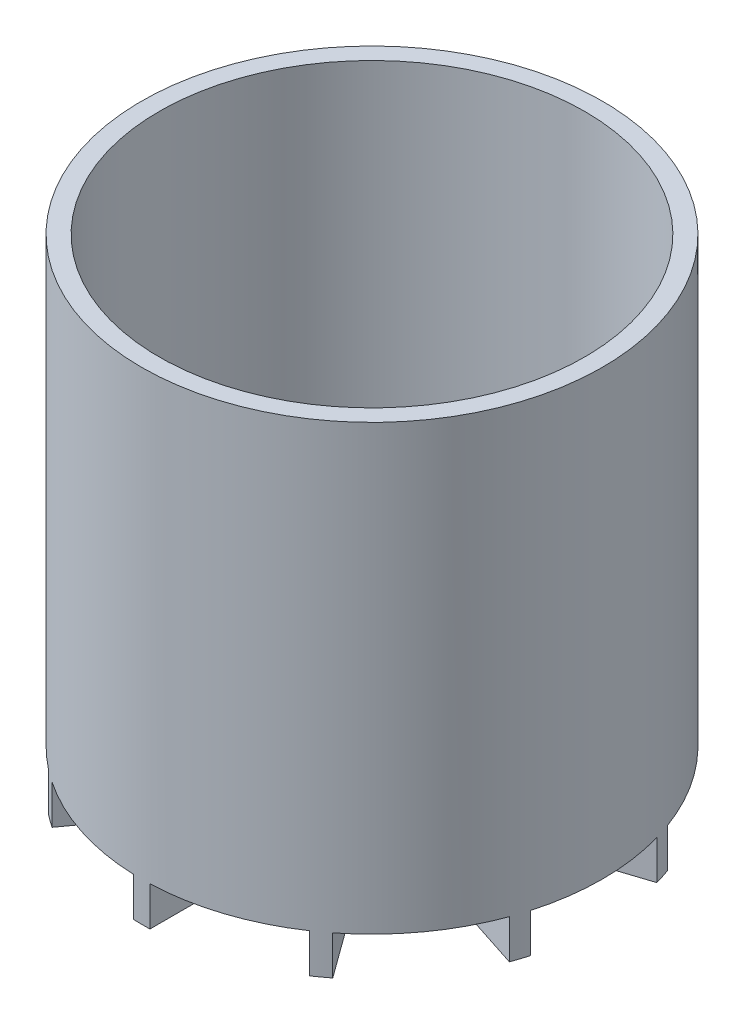
ISO-10303-21;
HEADER;
FILE_DESCRIPTION(('STEP AP214'),'2;1');
FILE_NAME('part.step','',(''),(''),'','','');
FILE_SCHEMA(('AUTOMOTIVE_DESIGN { 1 0 10303 214 1 1 1 1 }'));
ENDSEC;
DATA;
#1=APPLICATION_CONTEXT('core data for automotive mechanical design processes');
#2=APPLICATION_PROTOCOL_DEFINITION('international standard','automotive_design',2000,#1);
#3=PRODUCT_CONTEXT('',#1,'mechanical');
#4=PRODUCT('Part','Part','',(#3));
#5=PRODUCT_RELATED_PRODUCT_CATEGORY('part','',(#4));
#6=PRODUCT_DEFINITION_FORMATION('','',#4);
#7=PRODUCT_DEFINITION_CONTEXT('part definition',#1,'design');
#8=PRODUCT_DEFINITION('design','',#6,#7);
#9=PRODUCT_DEFINITION_SHAPE('','',#8);
#10=(LENGTH_UNIT() NAMED_UNIT(*) SI_UNIT(.MILLI.,.METRE.));
#11=(NAMED_UNIT(*) PLANE_ANGLE_UNIT() SI_UNIT($,.RADIAN.));
#12=(NAMED_UNIT(*) SI_UNIT($,.STERADIAN.) SOLID_ANGLE_UNIT());
#13=UNCERTAINTY_MEASURE_WITH_UNIT(LENGTH_MEASURE(1.E-05),#10,'distance_accuracy_value','');
#14=(GEOMETRIC_REPRESENTATION_CONTEXT(3) GLOBAL_UNCERTAINTY_ASSIGNED_CONTEXT((#13)) GLOBAL_UNIT_ASSIGNED_CONTEXT((#10,
#11,#12)) REPRESENTATION_CONTEXT('',''));
#15=CARTESIAN_POINT('',(0.,0.,0.));
#16=DIRECTION('',(0.,0.,1.));
#17=DIRECTION('',(1.,0.,0.));
#18=AXIS2_PLACEMENT_3D('',#15,#16,#17);
#19=CARTESIAN_POINT('',(0.,3.71094018845128,0.));
#20=DIRECTION('',(0.,-1.,0.));
#21=DIRECTION('',(0.,0.,-1.));
#22=AXIS2_PLACEMENT_3D('',#19,#20,#21);
#23=PLANE('',#22);
#24=DIRECTION('',(-0.587785252292469,0.,0.809016994374951));
#25=VECTOR('',#24,1.);
#26=CARTESIAN_POINT('',(14.1829604903441,3.71094018845128,-21.0916026592399));
#27=LINE('',#26,#25);
#28=CARTESIAN_POINT('',(14.1730982807933,3.71094018845128,-21.0780284923181));
#29=VERTEX_POINT('',#28);
#30=CARTESIAN_POINT('',(0.923076923076934,3.71094018845128,-2.84093864970028));
#31=VERTEX_POINT('',#30);
#32=EDGE_CURVE('E557',#29,#31,#27,.T.);
#33=ORIENTED_EDGE('',*,*,#32,.F.);
#34=CARTESIAN_POINT('',(0.,3.71094018845128,0.));
#35=DIRECTION('',(0.,-1.,0.));
#36=DIRECTION('',(0.,0.,-1.));
#37=AXIS2_PLACEMENT_3D('',#34,#35,#36);
#38=CIRCLE('',#37,25.4);
#39=CARTESIAN_POINT('',(15.6666681165624,3.71094018845128,-19.9928864880859));
#40=VERTEX_POINT('',#39);
#41=EDGE_CURVE('E481',#29,#40,#38,.T.);
#42=ORIENTED_EDGE('',*,*,#41,.T.);
#43=DIRECTION('',(-0.587785252292469,0.,0.809016994374951));
#44=VECTOR('',#43,1.);
#45=CARTESIAN_POINT('',(15.6765303261133,3.71094018845128,-20.0064606550076));
#46=LINE('',#45,#44);
#47=CARTESIAN_POINT('',(2.41664675884607,3.71094018845128,-1.755796645468));
#48=VERTEX_POINT('',#47);
#49=EDGE_CURVE('E552',#40,#48,#46,.T.);
#50=ORIENTED_EDGE('',*,*,#49,.T.);
#51=DIRECTION('',(-0.951056516295152,0.,0.309016994374952));
#52=VECTOR('',#51,1.);
#53=CARTESIAN_POINT('',(23.8715890575508,3.71094018845128,-8.72692997985776));
#54=LINE('',#53,#52);
#55=CARTESIAN_POINT('',(23.8556316672933,3.71094018845128,-8.72174510946262));
#56=VERTEX_POINT('',#55);
#57=EDGE_CURVE('E542',#56,#48,#54,.T.);
#58=ORIENTED_EDGE('',*,*,#57,.F.);
#59=CARTESIAN_POINT('',(24.4261245799855,3.71094018845128,-6.96594846399464));
#60=VERTEX_POINT('',#59);
#61=EDGE_CURVE('E687',#56,#60,#38,.T.);
#62=ORIENTED_EDGE('',*,*,#61,.T.);
#63=DIRECTION('',(-0.951056516295152,0.,0.309016994374952));
#64=VECTOR('',#63,1.);
#65=CARTESIAN_POINT('',(24.442081970243,3.71094018845128,-6.97113333438978));
#66=LINE('',#65,#64);
#67=CARTESIAN_POINT('',(2.98713967153826,3.71094018845128,0.));
#68=VERTEX_POINT('',#67);
#69=EDGE_CURVE('E537',#60,#68,#66,.T.);
#70=ORIENTED_EDGE('',*,*,#69,.T.);
#71=DIRECTION('',(-0.951056516295154,0.,-0.309016994374945));
#72=VECTOR('',#71,1.);
#73=CARTESIAN_POINT('',(24.442081970243,3.71094018845128,6.97113333438961));
#74=LINE('',#73,#72);
#75=CARTESIAN_POINT('',(24.4261245799855,3.71094018845128,6.96594846399447));
#76=VERTEX_POINT('',#75);
#77=EDGE_CURVE('E527',#76,#68,#74,.T.);
#78=ORIENTED_EDGE('',*,*,#77,.F.);
#79=CARTESIAN_POINT('',(23.8556316672933,3.71094018845128,8.72174510946245));
#80=VERTEX_POINT('',#79);
#81=EDGE_CURVE('E688',#76,#80,#38,.T.);
#82=ORIENTED_EDGE('',*,*,#81,.T.);
#83=DIRECTION('',(-0.951056516295154,0.,-0.309016994374945));
#84=VECTOR('',#83,1.);
#85=CARTESIAN_POINT('',(23.8715890575508,3.71094018845128,8.72692997985759));
#86=LINE('',#85,#84);
#87=CARTESIAN_POINT('',(2.41664675884606,3.71094018845128,1.75579664546797));
#88=VERTEX_POINT('',#87);
#89=EDGE_CURVE('E523',#80,#88,#86,.T.);
#90=ORIENTED_EDGE('',*,*,#89,.T.);
#91=DIRECTION('',(-0.587785252292474,0.,-0.809016994374947));
#92=VECTOR('',#91,1.);
#93=CARTESIAN_POINT('',(15.6765303261134,3.71094018845128,20.0064606550075));
#94=LINE('',#93,#92);
#95=CARTESIAN_POINT('',(15.6666681165625,3.71094018845128,19.9928864880858));
#96=VERTEX_POINT('',#95);
#97=EDGE_CURVE('E512',#96,#88,#94,.T.);
#98=ORIENTED_EDGE('',*,*,#97,.F.);
#99=CARTESIAN_POINT('',(14.1730982807934,3.71094018845128,21.0780284923181));
#100=VERTEX_POINT('',#99);
#101=EDGE_CURVE('E690',#96,#100,#38,.T.);
#102=ORIENTED_EDGE('',*,*,#101,.T.);
#103=DIRECTION('',(-0.587785252292474,0.,-0.809016994374947));
#104=VECTOR('',#103,1.);
#105=CARTESIAN_POINT('',(14.1829604903443,3.71094018845128,21.0916026592398));
#106=LINE('',#105,#104);
#107=CARTESIAN_POINT('',(0.923076923076928,3.71094018845128,2.84093864970024));
#108=VERTEX_POINT('',#107);
#109=EDGE_CURVE('E507',#100,#108,#106,.T.);
#110=ORIENTED_EDGE('',*,*,#109,.T.);
#111=DIRECTION('',(0.,0.,-1.));
#112=VECTOR('',#111,1.);
#113=CARTESIAN_POINT('',(0.923076923076929,3.71094018845128,25.4));
#114=LINE('',#113,#112);
#115=CARTESIAN_POINT('',(0.923076923076929,3.71094018845128,25.3832214069468));
#116=VERTEX_POINT('',#115);
#117=EDGE_CURVE('E493',#116,#108,#114,.T.);
#118=ORIENTED_EDGE('',*,*,#117,.F.);
#119=CARTESIAN_POINT('',(-0.923076923076917,3.71094018845128,25.3832214069468));
#120=VERTEX_POINT('',#119);
#121=EDGE_CURVE('E692',#116,#120,#38,.T.);
#122=ORIENTED_EDGE('',*,*,#121,.T.);
#123=DIRECTION('',(0.,0.,-1.));
#124=VECTOR('',#123,1.);
#125=CARTESIAN_POINT('',(-0.923076923076917,3.71094018845128,25.4));
#126=LINE('',#125,#124);
#127=CARTESIAN_POINT('',(-0.923076923076913,3.71094018845128,2.84093864970025));
#128=VERTEX_POINT('',#127);
#129=EDGE_CURVE('E494',#120,#128,#126,.T.);
#130=ORIENTED_EDGE('',*,*,#129,.T.);
#131=CARTESIAN_POINT('',(-14.1730982807932,3.71094018845128,21.0780284923181));
#132=VERTEX_POINT('',#131);
#133=EDGE_CURVE('E556',#128,#132,#46,.T.);
#134=ORIENTED_EDGE('',*,*,#133,.T.);
#135=CARTESIAN_POINT('',(-15.6666681165624,3.71094018845128,19.9928864880859));
#136=VERTEX_POINT('',#135);
#137=EDGE_CURVE('E297',#132,#136,#38,.T.);
#138=ORIENTED_EDGE('',*,*,#137,.T.);
#139=CARTESIAN_POINT('',(-2.41664675884601,3.71094018845128,1.75579664546797));
#140=VERTEX_POINT('',#139);
#141=EDGE_CURVE('E555',#140,#136,#27,.T.);
#142=ORIENTED_EDGE('',*,*,#141,.F.);
#143=CARTESIAN_POINT('',(-23.8556316672933,3.71094018845128,8.72174510946262));
#144=VERTEX_POINT('',#143);
#145=EDGE_CURVE('E541',#140,#144,#66,.T.);
#146=ORIENTED_EDGE('',*,*,#145,.T.);
#147=CARTESIAN_POINT('',(-24.4261245799855,3.71094018845128,6.96594846399465));
#148=VERTEX_POINT('',#147);
#149=EDGE_CURVE('E290',#144,#148,#38,.T.);
#150=ORIENTED_EDGE('',*,*,#149,.T.);
#151=CARTESIAN_POINT('',(-2.98713967153826,3.71094018845128,0.));
#152=VERTEX_POINT('',#151);
#153=EDGE_CURVE('E540',#152,#148,#54,.T.);
#154=ORIENTED_EDGE('',*,*,#153,.F.);
#155=CARTESIAN_POINT('',(-24.4261245799855,3.71094018845128,-6.96594846399447));
#156=VERTEX_POINT('',#155);
#157=EDGE_CURVE('E526',#152,#156,#86,.T.);
#158=ORIENTED_EDGE('',*,*,#157,.T.);
#159=CARTESIAN_POINT('',(-23.8556316672933,3.71094018845128,-8.72174510946244));
#160=VERTEX_POINT('',#159);
#161=EDGE_CURVE('E695',#156,#160,#38,.T.);
#162=ORIENTED_EDGE('',*,*,#161,.T.);
#163=CARTESIAN_POINT('',(-2.41664675884605,3.71094018845128,-1.75579664546796));
#164=VERTEX_POINT('',#163);
#165=EDGE_CURVE('E525',#164,#160,#74,.T.);
#166=ORIENTED_EDGE('',*,*,#165,.F.);
#167=CARTESIAN_POINT('',(-15.6666681165625,3.71094018845128,-19.9928864880858));
#168=VERTEX_POINT('',#167);
#169=EDGE_CURVE('E511',#164,#168,#106,.T.);
#170=ORIENTED_EDGE('',*,*,#169,.T.);
#171=CARTESIAN_POINT('',(-14.1730982807934,3.71094018845128,-21.078028492318));
#172=VERTEX_POINT('',#171);
#173=EDGE_CURVE('E479',#168,#172,#38,.T.);
#174=ORIENTED_EDGE('',*,*,#173,.T.);
#175=CARTESIAN_POINT('',(-0.923076923076918,3.71094018845128,-2.84093864970022));
#176=VERTEX_POINT('',#175);
#177=EDGE_CURVE('E510',#176,#172,#94,.T.);
#178=ORIENTED_EDGE('',*,*,#177,.F.);
#179=CARTESIAN_POINT('',(-0.923076923076917,3.71094018845128,-25.3832214069468));
#180=VERTEX_POINT('',#179);
#181=EDGE_CURVE('E477',#176,#180,#126,.T.);
#182=ORIENTED_EDGE('',*,*,#181,.T.);
#183=CARTESIAN_POINT('',(0.923076923076929,3.71094018845128,-25.3832214069468));
#184=VERTEX_POINT('',#183);
#185=EDGE_CURVE('E470',#180,#184,#38,.T.);
#186=ORIENTED_EDGE('',*,*,#185,.T.);
#187=EDGE_CURVE('E474',#31,#184,#114,.T.);
#188=ORIENTED_EDGE('',*,*,#187,.F.);
#189=EDGE_LOOP('',(#33,#42,#50,#58,#62,#70,#78,#82,#90,#98,#102,#110,#118,#122,#130,#134,#138,
#142,#146,#150,#154,#158,#162,#166,#170,#174,#178,#182,#186,#188));
#190=FACE_BOUND('',#189,.T.);
#191=ADVANCED_FACE('F275',(#190),#23,.T.);
#192=CARTESIAN_POINT('',(-0.923076923076917,3.71094018845128,25.4));
#193=DIRECTION('',(1.,0.,0.));
#194=DIRECTION('',(0.,0.,-1.));
#195=AXIS2_PLACEMENT_3D('',#192,#193,#194);
#196=PLANE('',#195);
#197=DIRECTION('',(0.,-1.,0.));
#198=VECTOR('',#197,1.);
#199=CARTESIAN_POINT('',(-0.923076923076917,56.8647863422974,25.3832214069468));
#200=LINE('',#199,#198);
#201=CARTESIAN_POINT('',(-0.923076923076917,8.01863249614359,25.3832214069468));
#202=VERTEX_POINT('',#201);
#203=EDGE_CURVE('E644',#202,#120,#200,.T.);
#204=ORIENTED_EDGE('',*,*,#203,.F.);
#205=DIRECTION('',(0.,0.,-1.));
#206=VECTOR('',#205,1.);
#207=CARTESIAN_POINT('',(-0.923076923076917,8.01863249614359,25.4));
#208=LINE('',#207,#206);
#209=CARTESIAN_POINT('',(-0.923076923076913,8.01863249614359,2.84093864970025));
#210=VERTEX_POINT('',#209);
#211=EDGE_CURVE('E283',#202,#210,#208,.T.);
#212=ORIENTED_EDGE('',*,*,#211,.T.);
#213=DIRECTION('',(0.,1.,0.));
#214=VECTOR('',#213,1.);
#215=CARTESIAN_POINT('',(-0.923076923076917,3.71094018845128,2.84093864970026));
#216=LINE('',#215,#214);
#217=EDGE_CURVE('E578',#128,#210,#216,.T.);
#218=ORIENTED_EDGE('',*,*,#217,.F.);
#219=ORIENTED_EDGE('',*,*,#129,.F.);
#220=EDGE_LOOP('',(#204,#212,#218,#219));
#221=FACE_BOUND('',#220,.T.);
#222=ADVANCED_FACE('F758',(#221),#196,.F.);
#223=CARTESIAN_POINT('',(0.923076923076929,3.71094018845128,25.4));
#224=DIRECTION('',(1.,0.,0.));
#225=DIRECTION('',(0.,0.,-1.));
#226=AXIS2_PLACEMENT_3D('',#223,#224,#225);
#227=PLANE('',#226);
#228=DIRECTION('',(0.,0.,-1.));
#229=VECTOR('',#228,1.);
#230=CARTESIAN_POINT('',(0.923076923076929,8.01863249614359,25.4));
#231=LINE('',#230,#229);
#232=CARTESIAN_POINT('',(0.923076923076929,8.01863249614359,25.3832214069468));
#233=VERTEX_POINT('',#232);
#234=CARTESIAN_POINT('',(0.923076923076928,8.01863249614359,2.84093864970024));
#235=VERTEX_POINT('',#234);
#236=EDGE_CURVE('E501',#233,#235,#231,.T.);
#237=ORIENTED_EDGE('',*,*,#236,.F.);
#238=DIRECTION('',(0.,-1.,0.));
#239=VECTOR('',#238,1.);
#240=CARTESIAN_POINT('',(0.923076923076929,56.8647863422974,25.3832214069468));
#241=LINE('',#240,#239);
#242=EDGE_CURVE('E639',#233,#116,#241,.T.);
#243=ORIENTED_EDGE('',*,*,#242,.T.);
#244=ORIENTED_EDGE('',*,*,#117,.T.);
#245=DIRECTION('',(0.,1.,0.));
#246=VECTOR('',#245,1.);
#247=CARTESIAN_POINT('',(0.923076923076929,3.71094018845128,2.84093864970023));
#248=LINE('',#247,#246);
#249=EDGE_CURVE('E496',#108,#235,#248,.T.);
#250=ORIENTED_EDGE('',*,*,#249,.T.);
#251=EDGE_LOOP('',(#237,#243,#244,#250));
#252=FACE_BOUND('',#251,.T.);
#253=ADVANCED_FACE('F744',(#252),#227,.T.);
#254=CARTESIAN_POINT('',(23.8715890575508,3.71094018845128,8.72692997985759));
#255=DIRECTION('',(0.309016994374945,0.,-0.951056516295154));
#256=DIRECTION('',(-0.951056516295155,0.,-0.309016994374945));
#257=AXIS2_PLACEMENT_3D('',#254,#255,#256);
#258=PLANE('',#257);
#259=DIRECTION('',(0.,-1.,0.));
#260=VECTOR('',#259,1.);
#261=CARTESIAN_POINT('',(-24.4261245799855,56.8647863422974,-6.96594846399447));
#262=LINE('',#261,#260);
#263=CARTESIAN_POINT('',(-24.4261245799855,8.01863249614359,-6.96594846399447));
#264=VERTEX_POINT('',#263);
#265=EDGE_CURVE('E649',#156,#264,#262,.F.);
#266=ORIENTED_EDGE('',*,*,#265,.F.);
#267=ORIENTED_EDGE('',*,*,#157,.F.);
#268=DIRECTION('',(0.,1.,0.));
#269=VECTOR('',#268,1.);
#270=CARTESIAN_POINT('',(-2.98713967153826,3.71094018845128,0.));
#271=LINE('',#270,#269);
#272=CARTESIAN_POINT('',(-2.98713967153826,8.01863249614359,0.));
#273=VERTEX_POINT('',#272);
#274=EDGE_CURVE('E572',#152,#273,#271,.T.);
#275=ORIENTED_EDGE('',*,*,#274,.T.);
#276=DIRECTION('',(-0.951056516295154,0.,-0.309016994374945));
#277=VECTOR('',#276,1.);
#278=CARTESIAN_POINT('',(23.8715890575508,8.01863249614359,8.72692997985759));
#279=LINE('',#278,#277);
#280=EDGE_CURVE('E532',#273,#264,#279,.T.);
#281=ORIENTED_EDGE('',*,*,#280,.T.);
#282=EDGE_LOOP('',(#266,#267,#275,#281));
#283=FACE_BOUND('',#282,.T.);
#284=ADVANCED_FACE('F768',(#283),#258,.F.);
#285=CARTESIAN_POINT('',(24.442081970243,3.71094018845128,6.97113333438961));
#286=DIRECTION('',(0.309016994374945,0.,-0.951056516295154));
#287=DIRECTION('',(-0.951056516295155,0.,-0.309016994374945));
#288=AXIS2_PLACEMENT_3D('',#285,#286,#287);
#289=PLANE('',#288);
#290=ORIENTED_EDGE('',*,*,#165,.T.);
#291=DIRECTION('',(0.,-1.,0.));
#292=VECTOR('',#291,1.);
#293=CARTESIAN_POINT('',(-23.8556316672933,56.8647863422974,-8.72174510946244));
#294=LINE('',#293,#292);
#295=CARTESIAN_POINT('',(-23.8556316672933,8.01863249614359,-8.72174510946244));
#296=VERTEX_POINT('',#295);
#297=EDGE_CURVE('E653',#160,#296,#294,.F.);
#298=ORIENTED_EDGE('',*,*,#297,.T.);
#299=DIRECTION('',(-0.951056516295154,0.,-0.309016994374945));
#300=VECTOR('',#299,1.);
#301=CARTESIAN_POINT('',(24.442081970243,8.01863249614359,6.97113333438961));
#302=LINE('',#301,#300);
#303=CARTESIAN_POINT('',(-2.41664675884605,8.01863249614359,-1.75579664546796));
#304=VERTEX_POINT('',#303);
#305=EDGE_CURVE('E536',#304,#296,#302,.T.);
#306=ORIENTED_EDGE('',*,*,#305,.F.);
#307=DIRECTION('',(0.,1.,0.));
#308=VECTOR('',#307,1.);
#309=CARTESIAN_POINT('',(-2.41664675884605,3.71094018845128,-1.75579664546797));
#310=LINE('',#309,#308);
#311=EDGE_CURVE('E576',#164,#304,#310,.T.);
#312=ORIENTED_EDGE('',*,*,#311,.F.);
#313=EDGE_LOOP('',(#290,#298,#306,#312));
#314=FACE_BOUND('',#313,.T.);
#315=ADVANCED_FACE('F778',(#314),#289,.T.);
#316=CARTESIAN_POINT('',(23.8715890575508,3.71094018845128,-8.72692997985776));
#317=DIRECTION('',(-0.309016994374952,0.,-0.951056516295152));
#318=DIRECTION('',(-0.951056516295152,0.,0.309016994374952));
#319=AXIS2_PLACEMENT_3D('',#316,#317,#318);
#320=PLANE('',#319);
#321=ORIENTED_EDGE('',*,*,#153,.T.);
#322=DIRECTION('',(0.,-1.,0.));
#323=VECTOR('',#322,1.);
#324=CARTESIAN_POINT('',(-24.4261245799855,56.8647863422974,6.96594846399465));
#325=LINE('',#324,#323);
#326=CARTESIAN_POINT('',(-24.4261245799855,8.01863249614359,6.96594846399465));
#327=VERTEX_POINT('',#326);
#328=EDGE_CURVE('E655',#148,#327,#325,.F.);
#329=ORIENTED_EDGE('',*,*,#328,.T.);
#330=DIRECTION('',(-0.951056516295152,0.,0.309016994374952));
#331=VECTOR('',#330,1.);
#332=CARTESIAN_POINT('',(23.8715890575508,8.01863249614359,-8.72692997985776));
#333=LINE('',#332,#331);
#334=EDGE_CURVE('E551',#273,#327,#333,.T.);
#335=ORIENTED_EDGE('',*,*,#334,.F.);
#336=ORIENTED_EDGE('',*,*,#274,.F.);
#337=EDGE_LOOP('',(#321,#329,#335,#336));
#338=FACE_BOUND('',#337,.T.);
#339=ADVANCED_FACE('F781',(#338),#320,.T.);
#340=CARTESIAN_POINT('',(24.442081970243,3.71094018845128,-6.97113333438978));
#341=DIRECTION('',(-0.309016994374952,0.,-0.951056516295152));
#342=DIRECTION('',(-0.951056516295152,0.,0.309016994374952));
#343=AXIS2_PLACEMENT_3D('',#340,#341,#342);
#344=PLANE('',#343);
#345=DIRECTION('',(0.,-1.,0.));
#346=VECTOR('',#345,1.);
#347=CARTESIAN_POINT('',(-23.8556316672932,56.8647863422974,8.72174510946262));
#348=LINE('',#347,#346);
#349=CARTESIAN_POINT('',(-23.8556316672932,8.01863249614359,8.72174510946262));
#350=VERTEX_POINT('',#349);
#351=EDGE_CURVE('E629',#144,#350,#348,.F.);
#352=ORIENTED_EDGE('',*,*,#351,.F.);
#353=ORIENTED_EDGE('',*,*,#145,.F.);
#354=DIRECTION('',(0.,1.,0.));
#355=VECTOR('',#354,1.);
#356=CARTESIAN_POINT('',(-2.41664675884604,3.71094018845128,1.75579664546799));
#357=LINE('',#356,#355);
#358=CARTESIAN_POINT('',(-2.41664675884601,8.01863249614359,1.75579664546797));
#359=VERTEX_POINT('',#358);
#360=EDGE_CURVE('E566',#140,#359,#357,.T.);
#361=ORIENTED_EDGE('',*,*,#360,.T.);
#362=DIRECTION('',(-0.951056516295152,0.,0.309016994374952));
#363=VECTOR('',#362,1.);
#364=CARTESIAN_POINT('',(24.442081970243,8.01863249614359,-6.97113333438978));
#365=LINE('',#364,#363);
#366=EDGE_CURVE('E547',#359,#350,#365,.T.);
#367=ORIENTED_EDGE('',*,*,#366,.T.);
#368=EDGE_LOOP('',(#352,#353,#361,#367));
#369=FACE_BOUND('',#368,.T.);
#370=ADVANCED_FACE('F776',(#369),#344,.F.);
#371=CARTESIAN_POINT('',(14.1829604903443,3.71094018845128,21.0916026592398));
#372=DIRECTION('',(0.809016994374947,0.,-0.587785252292474));
#373=DIRECTION('',(-0.587785252292474,0.,-0.809016994374947));
#374=AXIS2_PLACEMENT_3D('',#371,#372,#373);
#375=PLANE('',#374);
#376=DIRECTION('',(0.,-1.,0.));
#377=VECTOR('',#376,1.);
#378=CARTESIAN_POINT('',(-15.6666681165625,56.8647863422974,-19.9928864880858));
#379=LINE('',#378,#377);
#380=CARTESIAN_POINT('',(-15.6666681165625,8.01863249614359,-19.9928864880858));
#381=VERTEX_POINT('',#380);
#382=EDGE_CURVE('E657',#168,#381,#379,.F.);
#383=ORIENTED_EDGE('',*,*,#382,.F.);
#384=ORIENTED_EDGE('',*,*,#169,.F.);
#385=ORIENTED_EDGE('',*,*,#311,.T.);
#386=DIRECTION('',(-0.587785252292474,0.,-0.809016994374947));
#387=VECTOR('',#386,1.);
#388=CARTESIAN_POINT('',(14.1829604903443,8.01863249614359,21.0916026592398));
#389=LINE('',#388,#387);
#390=EDGE_CURVE('E518',#304,#381,#389,.T.);
#391=ORIENTED_EDGE('',*,*,#390,.T.);
#392=EDGE_LOOP('',(#383,#384,#385,#391));
#393=FACE_BOUND('',#392,.T.);
#394=ADVANCED_FACE('F773',(#393),#375,.F.);
#395=CARTESIAN_POINT('',(15.6765303261134,3.71094018845128,20.0064606550075));
#396=DIRECTION('',(0.809016994374947,0.,-0.587785252292474));
#397=DIRECTION('',(-0.587785252292474,0.,-0.809016994374947));
#398=AXIS2_PLACEMENT_3D('',#395,#396,#397);
#399=PLANE('',#398);
#400=ORIENTED_EDGE('',*,*,#177,.T.);
#401=DIRECTION('',(0.,-1.,0.));
#402=VECTOR('',#401,1.);
#403=CARTESIAN_POINT('',(-14.1730982807934,56.8647863422974,-21.078028492318));
#404=LINE('',#403,#402);
#405=CARTESIAN_POINT('',(-14.1730982807934,8.01863249614359,-21.078028492318));
#406=VERTEX_POINT('',#405);
#407=EDGE_CURVE('E659',#172,#406,#404,.F.);
#408=ORIENTED_EDGE('',*,*,#407,.T.);
#409=DIRECTION('',(-0.587785252292474,0.,-0.809016994374947));
#410=VECTOR('',#409,1.);
#411=CARTESIAN_POINT('',(15.6765303261134,8.01863249614359,20.0064606550075));
#412=LINE('',#411,#410);
#413=CARTESIAN_POINT('',(-0.923076923076918,8.01863249614359,-2.84093864970022));
#414=VERTEX_POINT('',#413);
#415=EDGE_CURVE('E522',#414,#406,#412,.T.);
#416=ORIENTED_EDGE('',*,*,#415,.F.);
#417=DIRECTION('',(0.,1.,0.));
#418=VECTOR('',#417,1.);
#419=CARTESIAN_POINT('',(-0.923076923076917,3.71094018845128,-2.84093864970022));
#420=LINE('',#419,#418);
#421=EDGE_CURVE('E581',#176,#414,#420,.T.);
#422=ORIENTED_EDGE('',*,*,#421,.F.);
#423=EDGE_LOOP('',(#400,#408,#416,#422));
#424=FACE_BOUND('',#423,.T.);
#425=ADVANCED_FACE('F707',(#424),#399,.T.);
#426=CARTESIAN_POINT('',(14.1829604903441,3.71094018845128,-21.0916026592399));
#427=DIRECTION('',(-0.809016994374951,0.,-0.587785252292469));
#428=DIRECTION('',(-0.587785252292469,0.,0.809016994374951));
#429=AXIS2_PLACEMENT_3D('',#426,#427,#428);
#430=PLANE('',#429);
#431=ORIENTED_EDGE('',*,*,#141,.T.);
#432=DIRECTION('',(0.,-1.,0.));
#433=VECTOR('',#432,1.);
#434=CARTESIAN_POINT('',(-15.6666681165624,56.8647863422974,19.9928864880859));
#435=LINE('',#434,#433);
#436=CARTESIAN_POINT('',(-15.6666681165624,8.01863249614359,19.9928864880859));
#437=VERTEX_POINT('',#436);
#438=EDGE_CURVE('E627',#136,#437,#435,.F.);
#439=ORIENTED_EDGE('',*,*,#438,.T.);
#440=DIRECTION('',(-0.587785252292469,0.,0.809016994374951));
#441=VECTOR('',#440,1.);
#442=CARTESIAN_POINT('',(14.1829604903441,8.01863249614359,-21.0916026592399));
#443=LINE('',#442,#441);
#444=EDGE_CURVE('E565',#359,#437,#443,.T.);
#445=ORIENTED_EDGE('',*,*,#444,.F.);
#446=ORIENTED_EDGE('',*,*,#360,.F.);
#447=EDGE_LOOP('',(#431,#439,#445,#446));
#448=FACE_BOUND('',#447,.T.);
#449=ADVANCED_FACE('F772',(#448),#430,.T.);
#450=CARTESIAN_POINT('',(15.6765303261133,3.71094018845128,-20.0064606550076));
#451=DIRECTION('',(-0.809016994374951,0.,-0.587785252292469));
#452=DIRECTION('',(-0.587785252292469,0.,0.809016994374951));
#453=AXIS2_PLACEMENT_3D('',#450,#451,#452);
#454=PLANE('',#453);
#455=DIRECTION('',(0.,-1.,0.));
#456=VECTOR('',#455,1.);
#457=CARTESIAN_POINT('',(-14.1730982807932,56.8647863422974,21.0780284923181));
#458=LINE('',#457,#456);
#459=CARTESIAN_POINT('',(-14.1730982807932,8.01863249614359,21.0780284923181));
#460=VERTEX_POINT('',#459);
#461=EDGE_CURVE('E663',#132,#460,#458,.F.);
#462=ORIENTED_EDGE('',*,*,#461,.F.);
#463=ORIENTED_EDGE('',*,*,#133,.F.);
#464=ORIENTED_EDGE('',*,*,#217,.T.);
#465=DIRECTION('',(-0.587785252292469,0.,0.809016994374951));
#466=VECTOR('',#465,1.);
#467=CARTESIAN_POINT('',(15.6765303261133,8.01863249614359,-20.0064606550076));
#468=LINE('',#467,#466);
#469=EDGE_CURVE('E561',#210,#460,#468,.T.);
#470=ORIENTED_EDGE('',*,*,#469,.T.);
#471=EDGE_LOOP('',(#462,#463,#464,#470));
#472=FACE_BOUND('',#471,.T.);
#473=ADVANCED_FACE('F794',(#472),#454,.F.);
#474=CARTESIAN_POINT('',(24.4261245799855,8.01863249614359,6.96594846399447));
#475=VERTEX_POINT('',#474);
#476=CARTESIAN_POINT('',(2.98713967153826,8.01863249614359,0.));
#477=VERTEX_POINT('',#476);
#478=EDGE_CURVE('E531',#475,#477,#302,.T.);
#479=ORIENTED_EDGE('',*,*,#478,.F.);
#480=DIRECTION('',(0.,-1.,0.));
#481=VECTOR('',#480,1.);
#482=CARTESIAN_POINT('',(24.4261245799855,56.8647863422974,6.96594846399447));
#483=LINE('',#482,#481);
#484=EDGE_CURVE('E667',#475,#76,#483,.T.);
#485=ORIENTED_EDGE('',*,*,#484,.T.);
#486=ORIENTED_EDGE('',*,*,#77,.T.);
#487=DIRECTION('',(0.,1.,0.));
#488=VECTOR('',#487,1.);
#489=CARTESIAN_POINT('',(2.98713967153826,3.71094018845128,0.));
#490=LINE('',#489,#488);
#491=EDGE_CURVE('E529',#68,#477,#490,.T.);
#492=ORIENTED_EDGE('',*,*,#491,.T.);
#493=EDGE_LOOP('',(#479,#485,#486,#492));
#494=FACE_BOUND('',#493,.T.);
#495=ADVANCED_FACE('F730',(#494),#289,.T.);
#496=DIRECTION('',(0.,-1.,0.));
#497=VECTOR('',#496,1.);
#498=CARTESIAN_POINT('',(24.4261245799855,56.8647863422974,-6.96594846399464));
#499=LINE('',#498,#497);
#500=CARTESIAN_POINT('',(24.4261245799855,8.01863249614359,-6.96594846399464));
#501=VERTEX_POINT('',#500);
#502=EDGE_CURVE('E665',#501,#60,#499,.T.);
#503=ORIENTED_EDGE('',*,*,#502,.F.);
#504=EDGE_CURVE('E535',#501,#477,#365,.T.);
#505=ORIENTED_EDGE('',*,*,#504,.T.);
#506=ORIENTED_EDGE('',*,*,#491,.F.);
#507=ORIENTED_EDGE('',*,*,#69,.F.);
#508=EDGE_LOOP('',(#503,#505,#506,#507));
#509=FACE_BOUND('',#508,.T.);
#510=ADVANCED_FACE('F727',(#509),#344,.F.);
#511=CARTESIAN_POINT('',(23.8556316672933,8.01863249614359,-8.72174510946262));
#512=VERTEX_POINT('',#511);
#513=CARTESIAN_POINT('',(2.41664675884607,8.01863249614359,-1.755796645468));
#514=VERTEX_POINT('',#513);
#515=EDGE_CURVE('E546',#512,#514,#333,.T.);
#516=ORIENTED_EDGE('',*,*,#515,.F.);
#517=DIRECTION('',(0.,-1.,0.));
#518=VECTOR('',#517,1.);
#519=CARTESIAN_POINT('',(23.8556316672933,56.8647863422974,-8.72174510946262));
#520=LINE('',#519,#518);
#521=EDGE_CURVE('E670',#512,#56,#520,.T.);
#522=ORIENTED_EDGE('',*,*,#521,.T.);
#523=ORIENTED_EDGE('',*,*,#57,.T.);
#524=DIRECTION('',(0.,1.,0.));
#525=VECTOR('',#524,1.);
#526=CARTESIAN_POINT('',(2.41664675884605,3.71094018845128,-1.75579664546798));
#527=LINE('',#526,#525);
#528=EDGE_CURVE('E544',#48,#514,#527,.T.);
#529=ORIENTED_EDGE('',*,*,#528,.T.);
#530=EDGE_LOOP('',(#516,#522,#523,#529));
#531=FACE_BOUND('',#530,.T.);
#532=ADVANCED_FACE('F722',(#531),#320,.T.);
#533=DIRECTION('',(0.,-1.,0.));
#534=VECTOR('',#533,1.);
#535=CARTESIAN_POINT('',(23.8556316672933,56.8647863422974,8.72174510946245));
#536=LINE('',#535,#534);
#537=CARTESIAN_POINT('',(23.8556316672933,8.01863249614359,8.72174510946245));
#538=VERTEX_POINT('',#537);
#539=EDGE_CURVE('E673',#538,#80,#536,.T.);
#540=ORIENTED_EDGE('',*,*,#539,.F.);
#541=CARTESIAN_POINT('',(2.41664675884606,8.01863249614359,1.75579664546797));
#542=VERTEX_POINT('',#541);
#543=EDGE_CURVE('E521',#538,#542,#279,.T.);
#544=ORIENTED_EDGE('',*,*,#543,.T.);
#545=DIRECTION('',(0.,1.,0.));
#546=VECTOR('',#545,1.);
#547=CARTESIAN_POINT('',(2.41664675884606,3.71094018845128,1.75579664546797));
#548=LINE('',#547,#546);
#549=EDGE_CURVE('E515',#88,#542,#548,.T.);
#550=ORIENTED_EDGE('',*,*,#549,.F.);
#551=ORIENTED_EDGE('',*,*,#89,.F.);
#552=EDGE_LOOP('',(#540,#544,#550,#551));
#553=FACE_BOUND('',#552,.T.);
#554=ADVANCED_FACE('F735',(#553),#258,.F.);
#555=CARTESIAN_POINT('',(14.1730982807933,8.01863249614359,-21.0780284923181));
#556=VERTEX_POINT('',#555);
#557=CARTESIAN_POINT('',(0.923076923076934,8.01863249614359,-2.84093864970028));
#558=VERTEX_POINT('',#557);
#559=EDGE_CURVE('E560',#556,#558,#443,.T.);
#560=ORIENTED_EDGE('',*,*,#559,.F.);
#561=DIRECTION('',(0.,-1.,0.));
#562=VECTOR('',#561,1.);
#563=CARTESIAN_POINT('',(14.1730982807933,56.8647863422974,-21.0780284923181));
#564=LINE('',#563,#562);
#565=EDGE_CURVE('E675',#556,#29,#564,.T.);
#566=ORIENTED_EDGE('',*,*,#565,.T.);
#567=ORIENTED_EDGE('',*,*,#32,.T.);
#568=DIRECTION('',(0.,1.,0.));
#569=VECTOR('',#568,1.);
#570=CARTESIAN_POINT('',(0.923076923076929,3.71094018845128,-2.84093864970026));
#571=LINE('',#570,#569);
#572=EDGE_CURVE('E492',#31,#558,#571,.T.);
#573=ORIENTED_EDGE('',*,*,#572,.T.);
#574=EDGE_LOOP('',(#560,#566,#567,#573));
#575=FACE_BOUND('',#574,.T.);
#576=ADVANCED_FACE('F714',(#575),#430,.T.);
#577=DIRECTION('',(0.,-1.,0.));
#578=VECTOR('',#577,1.);
#579=CARTESIAN_POINT('',(15.6666681165624,56.8647863422974,-19.9928864880859));
#580=LINE('',#579,#578);
#581=CARTESIAN_POINT('',(15.6666681165624,8.01863249614359,-19.9928864880859));
#582=VERTEX_POINT('',#581);
#583=EDGE_CURVE('E678',#582,#40,#580,.T.);
#584=ORIENTED_EDGE('',*,*,#583,.F.);
#585=EDGE_CURVE('E550',#582,#514,#468,.T.);
#586=ORIENTED_EDGE('',*,*,#585,.T.);
#587=ORIENTED_EDGE('',*,*,#528,.F.);
#588=ORIENTED_EDGE('',*,*,#49,.F.);
#589=EDGE_LOOP('',(#584,#586,#587,#588));
#590=FACE_BOUND('',#589,.T.);
#591=ADVANCED_FACE('F719',(#590),#454,.F.);
#592=CARTESIAN_POINT('',(15.6666681165625,8.01863249614359,19.9928864880858));
#593=VERTEX_POINT('',#592);
#594=EDGE_CURVE('E517',#593,#542,#412,.T.);
#595=ORIENTED_EDGE('',*,*,#594,.F.);
#596=DIRECTION('',(0.,-1.,0.));
#597=VECTOR('',#596,1.);
#598=CARTESIAN_POINT('',(15.6666681165625,56.8647863422974,19.9928864880858));
#599=LINE('',#598,#597);
#600=EDGE_CURVE('E680',#593,#96,#599,.T.);
#601=ORIENTED_EDGE('',*,*,#600,.T.);
#602=ORIENTED_EDGE('',*,*,#97,.T.);
#603=ORIENTED_EDGE('',*,*,#549,.T.);
#604=EDGE_LOOP('',(#595,#601,#602,#603));
#605=FACE_BOUND('',#604,.T.);
#606=ADVANCED_FACE('F738',(#605),#399,.T.);
#607=DIRECTION('',(0.,-1.,0.));
#608=VECTOR('',#607,1.);
#609=CARTESIAN_POINT('',(14.1730982807934,56.8647863422974,21.078028492318));
#610=LINE('',#609,#608);
#611=CARTESIAN_POINT('',(14.1730982807934,8.01863249614359,21.0780284923181));
#612=VERTEX_POINT('',#611);
#613=EDGE_CURVE('E683',#612,#100,#610,.T.);
#614=ORIENTED_EDGE('',*,*,#613,.F.);
#615=EDGE_CURVE('E505',#612,#235,#389,.T.);
#616=ORIENTED_EDGE('',*,*,#615,.T.);
#617=ORIENTED_EDGE('',*,*,#249,.F.);
#618=ORIENTED_EDGE('',*,*,#109,.F.);
#619=EDGE_LOOP('',(#614,#616,#617,#618));
#620=FACE_BOUND('',#619,.T.);
#621=ADVANCED_FACE('F743',(#620),#375,.F.);
#622=DIRECTION('',(0.,-1.,0.));
#623=VECTOR('',#622,1.);
#624=CARTESIAN_POINT('',(-0.923076923076917,56.8647863422974,-25.3832214069468));
#625=LINE('',#624,#623);
#626=CARTESIAN_POINT('',(-0.923076923076917,8.01863249614359,-25.3832214069468));
#627=VERTEX_POINT('',#626);
#628=EDGE_CURVE('E685',#180,#627,#625,.F.);
#629=ORIENTED_EDGE('',*,*,#628,.F.);
#630=ORIENTED_EDGE('',*,*,#181,.F.);
#631=ORIENTED_EDGE('',*,*,#421,.T.);
#632=EDGE_CURVE('E502',#414,#627,#208,.T.);
#633=ORIENTED_EDGE('',*,*,#632,.T.);
#634=EDGE_LOOP('',(#629,#630,#631,#633));
#635=FACE_BOUND('',#634,.T.);
#636=ADVANCED_FACE('F710',(#635),#196,.F.);
#637=ORIENTED_EDGE('',*,*,#187,.T.);
#638=DIRECTION('',(0.,-1.,0.));
#639=VECTOR('',#638,1.);
#640=CARTESIAN_POINT('',(0.923076923076929,56.8647863422974,-25.3832214069468));
#641=LINE('',#640,#639);
#642=CARTESIAN_POINT('',(0.923076923076929,8.01863249614359,-25.3832214069468));
#643=VERTEX_POINT('',#642);
#644=EDGE_CURVE('E12',#184,#643,#641,.F.);
#645=ORIENTED_EDGE('',*,*,#644,.T.);
#646=EDGE_CURVE('E506',#558,#643,#231,.T.);
#647=ORIENTED_EDGE('',*,*,#646,.F.);
#648=ORIENTED_EDGE('',*,*,#572,.F.);
#649=EDGE_LOOP('',(#637,#645,#647,#648));
#650=FACE_BOUND('',#649,.T.);
#651=ADVANCED_FACE('F491',(#650),#227,.T.);
#652=CARTESIAN_POINT('',(0.,8.01863249614359,0.));
#653=DIRECTION('',(0.,1.,0.));
#654=DIRECTION('',(0.,0.,1.));
#655=AXIS2_PLACEMENT_3D('',#652,#653,#654);
#656=PLANE('',#655);
#657=ORIENTED_EDGE('',*,*,#366,.F.);
#658=ORIENTED_EDGE('',*,*,#444,.T.);
#659=CARTESIAN_POINT('',(0.,8.01863249614359,0.));
#660=DIRECTION('',(0.,1.,0.));
#661=DIRECTION('',(0.,0.,1.));
#662=AXIS2_PLACEMENT_3D('',#659,#660,#661);
#663=CIRCLE('',#662,25.4);
#664=EDGE_CURVE('E594',#350,#437,#663,.T.);
#665=ORIENTED_EDGE('',*,*,#664,.F.);
#666=EDGE_LOOP('',(#657,#658,#665));
#667=FACE_BOUND('',#666,.T.);
#668=ADVANCED_FACE('F634',(#667),#656,.F.);
#669=ORIENTED_EDGE('',*,*,#469,.F.);
#670=ORIENTED_EDGE('',*,*,#211,.F.);
#671=EDGE_CURVE('E590',#460,#202,#663,.T.);
#672=ORIENTED_EDGE('',*,*,#671,.F.);
#673=EDGE_LOOP('',(#669,#670,#672));
#674=FACE_BOUND('',#673,.T.);
#675=ADVANCED_FACE('F749',(#674),#656,.F.);
#676=EDGE_CURVE('E595',#233,#612,#663,.T.);
#677=ORIENTED_EDGE('',*,*,#676,.F.);
#678=ORIENTED_EDGE('',*,*,#236,.T.);
#679=ORIENTED_EDGE('',*,*,#615,.F.);
#680=EDGE_LOOP('',(#677,#678,#679));
#681=FACE_BOUND('',#680,.T.);
#682=ADVANCED_FACE('F746',(#681),#656,.F.);
#683=EDGE_CURVE('E600',#593,#538,#663,.T.);
#684=ORIENTED_EDGE('',*,*,#683,.F.);
#685=ORIENTED_EDGE('',*,*,#594,.T.);
#686=ORIENTED_EDGE('',*,*,#543,.F.);
#687=EDGE_LOOP('',(#684,#685,#686));
#688=FACE_BOUND('',#687,.T.);
#689=ADVANCED_FACE('F748',(#688),#656,.F.);
#690=EDGE_CURVE('E604',#475,#501,#663,.T.);
#691=ORIENTED_EDGE('',*,*,#690,.F.);
#692=ORIENTED_EDGE('',*,*,#478,.T.);
#693=ORIENTED_EDGE('',*,*,#504,.F.);
#694=EDGE_LOOP('',(#691,#692,#693));
#695=FACE_BOUND('',#694,.T.);
#696=ADVANCED_FACE('F754',(#695),#656,.F.);
#697=EDGE_CURVE('E608',#512,#582,#663,.T.);
#698=ORIENTED_EDGE('',*,*,#697,.F.);
#699=ORIENTED_EDGE('',*,*,#515,.T.);
#700=ORIENTED_EDGE('',*,*,#585,.F.);
#701=EDGE_LOOP('',(#698,#699,#700));
#702=FACE_BOUND('',#701,.T.);
#703=ADVANCED_FACE('F952',(#702),#656,.F.);
#704=ORIENTED_EDGE('',*,*,#632,.F.);
#705=ORIENTED_EDGE('',*,*,#415,.T.);
#706=EDGE_CURVE('E614',#627,#406,#663,.T.);
#707=ORIENTED_EDGE('',*,*,#706,.F.);
#708=EDGE_LOOP('',(#704,#705,#707));
#709=FACE_BOUND('',#708,.T.);
#710=ADVANCED_FACE('F819',(#709),#656,.F.);
#711=ORIENTED_EDGE('',*,*,#390,.F.);
#712=ORIENTED_EDGE('',*,*,#305,.T.);
#713=EDGE_CURVE('E616',#381,#296,#663,.T.);
#714=ORIENTED_EDGE('',*,*,#713,.F.);
#715=EDGE_LOOP('',(#711,#712,#714));
#716=FACE_BOUND('',#715,.T.);
#717=ADVANCED_FACE('F814',(#716),#656,.F.);
#718=ORIENTED_EDGE('',*,*,#280,.F.);
#719=ORIENTED_EDGE('',*,*,#334,.T.);
#720=EDGE_CURVE('E620',#264,#327,#663,.T.);
#721=ORIENTED_EDGE('',*,*,#720,.F.);
#722=EDGE_LOOP('',(#718,#719,#721));
#723=FACE_BOUND('',#722,.T.);
#724=ADVANCED_FACE('F809',(#723),#656,.F.);
#725=CARTESIAN_POINT('',(0.,56.8647863422974,0.));
#726=DIRECTION('',(0.,-1.,0.));
#727=DIRECTION('',(0.,0.,-1.));
#728=AXIS2_PLACEMENT_3D('',#725,#726,#727);
#729=CYLINDRICAL_SURFACE('',#728,25.4);
#730=ORIENTED_EDGE('',*,*,#242,.F.);
#731=ORIENTED_EDGE('',*,*,#676,.T.);
#732=ORIENTED_EDGE('',*,*,#613,.T.);
#733=ORIENTED_EDGE('',*,*,#101,.F.);
#734=ORIENTED_EDGE('',*,*,#600,.F.);
#735=ORIENTED_EDGE('',*,*,#683,.T.);
#736=ORIENTED_EDGE('',*,*,#539,.T.);
#737=ORIENTED_EDGE('',*,*,#81,.F.);
#738=ORIENTED_EDGE('',*,*,#484,.F.);
#739=ORIENTED_EDGE('',*,*,#690,.T.);
#740=ORIENTED_EDGE('',*,*,#502,.T.);
#741=ORIENTED_EDGE('',*,*,#61,.F.);
#742=ORIENTED_EDGE('',*,*,#521,.F.);
#743=ORIENTED_EDGE('',*,*,#697,.T.);
#744=ORIENTED_EDGE('',*,*,#583,.T.);
#745=ORIENTED_EDGE('',*,*,#41,.F.);
#746=ORIENTED_EDGE('',*,*,#565,.F.);
#747=EDGE_CURVE('E486',#556,#643,#663,.T.);
#748=ORIENTED_EDGE('',*,*,#747,.T.);
#749=ORIENTED_EDGE('',*,*,#644,.F.);
#750=ORIENTED_EDGE('',*,*,#185,.F.);
#751=ORIENTED_EDGE('',*,*,#628,.T.);
#752=ORIENTED_EDGE('',*,*,#706,.T.);
#753=ORIENTED_EDGE('',*,*,#407,.F.);
#754=ORIENTED_EDGE('',*,*,#173,.F.);
#755=ORIENTED_EDGE('',*,*,#382,.T.);
#756=ORIENTED_EDGE('',*,*,#713,.T.);
#757=ORIENTED_EDGE('',*,*,#297,.F.);
#758=ORIENTED_EDGE('',*,*,#161,.F.);
#759=ORIENTED_EDGE('',*,*,#265,.T.);
#760=ORIENTED_EDGE('',*,*,#720,.T.);
#761=ORIENTED_EDGE('',*,*,#328,.F.);
#762=ORIENTED_EDGE('',*,*,#149,.F.);
#763=ORIENTED_EDGE('',*,*,#351,.T.);
#764=ORIENTED_EDGE('',*,*,#664,.T.);
#765=ORIENTED_EDGE('',*,*,#438,.F.);
#766=ORIENTED_EDGE('',*,*,#137,.F.);
#767=ORIENTED_EDGE('',*,*,#461,.T.);
#768=ORIENTED_EDGE('',*,*,#671,.T.);
#769=ORIENTED_EDGE('',*,*,#203,.T.);
#770=ORIENTED_EDGE('',*,*,#121,.F.);
#771=EDGE_LOOP('',(#730,#731,#732,#733,#734,#735,#736,#737,#738,#739,#740,#741,#742,#743,#744,
#745,#746,#748,#749,#750,#751,#752,#753,#754,#755,#756,#757,#758,#759,#760,#761,#762,#763,#764,
#765,#766,#767,#768,#769,#770));
#772=FACE_BOUND('',#771,.T.);
#773=CARTESIAN_POINT('',(0.,56.8647863422974,0.));
#774=DIRECTION('',(0.,1.,0.));
#775=DIRECTION('',(0.,0.,1.));
#776=AXIS2_PLACEMENT_3D('',#773,#774,#775);
#777=CIRCLE('',#776,25.4);
#778=CARTESIAN_POINT('',(0.,56.8647863422974,25.4));
#779=VERTEX_POINT('',#778);
#780=EDGE_CURVE('E564',#779,#779,#777,.T.);
#781=ORIENTED_EDGE('',*,*,#780,.F.);
#782=EDGE_LOOP('',(#781));
#783=FACE_BOUND('',#782,.T.);
#784=ADVANCED_FACE('F483',(#772,#783),#729,.T.);
#785=CARTESIAN_POINT('',(0.,56.8647863422974,0.));
#786=DIRECTION('',(0.,1.,0.));
#787=DIRECTION('',(0.,0.,1.));
#788=AXIS2_PLACEMENT_3D('',#785,#786,#787);
#789=PLANE('',#788);
#790=CARTESIAN_POINT('',(0.,56.8647863422974,0.));
#791=DIRECTION('',(0.,1.,0.));
#792=DIRECTION('',(0.,0.,1.));
#793=AXIS2_PLACEMENT_3D('',#790,#791,#792);
#794=CIRCLE('',#793,23.4461538461538);
#795=CARTESIAN_POINT('',(0.,56.8647863422974,-23.4461538461538));
#796=VERTEX_POINT('',#795);
#797=EDGE_CURVE('E587',#796,#796,#794,.T.);
#798=ORIENTED_EDGE('',*,*,#797,.F.);
#799=EDGE_LOOP('',(#798));
#800=FACE_BOUND('',#799,.T.);
#801=ORIENTED_EDGE('',*,*,#780,.T.);
#802=EDGE_LOOP('',(#801));
#803=FACE_BOUND('',#802,.T.);
#804=ADVANCED_FACE('F805',(#800,#803),#789,.T.);
#805=ORIENTED_EDGE('',*,*,#747,.F.);
#806=ORIENTED_EDGE('',*,*,#559,.T.);
#807=ORIENTED_EDGE('',*,*,#646,.T.);
#808=EDGE_LOOP('',(#805,#806,#807));
#809=FACE_BOUND('',#808,.T.);
#810=ADVANCED_FACE('F277',(#809),#656,.F.);
#811=CARTESIAN_POINT('',(0.,56.8647863422974,0.));
#812=DIRECTION('',(0.,-1.,0.));
#813=DIRECTION('',(0.,0.,-1.));
#814=AXIS2_PLACEMENT_3D('',#811,#812,#813);
#815=CYLINDRICAL_SURFACE('',#814,23.4461538461538);
#816=CARTESIAN_POINT('',(0.,9.97247864998974,0.));
#817=DIRECTION('',(0.,1.,0.));
#818=DIRECTION('',(0.,0.,1.));
#819=AXIS2_PLACEMENT_3D('',#816,#817,#818);
#820=CIRCLE('',#819,23.4461538461538);
#821=CARTESIAN_POINT('',(0.,9.97247864998974,-23.4461538461538));
#822=VERTEX_POINT('',#821);
#823=EDGE_CURVE('E586',#822,#822,#820,.T.);
#824=CARTESIAN_POINT('',(0.,56.8647863422974,-23.4461538461538));
#825=CARTESIAN_POINT('',(0.,56.3763248038359,-23.4461538461538));
#826=CARTESIAN_POINT('',(0.,55.8878632653744,-23.4461538461538));
#827=CARTESIAN_POINT('',(0.,54.9109401884513,-23.4461538461538));
#828=CARTESIAN_POINT('',(0.,54.4224786499897,-23.4461538461538));
#829=CARTESIAN_POINT('',(0.,53.4455555730667,-23.4461538461538));
#830=CARTESIAN_POINT('',(0.,52.9570940346051,-23.4461538461538));
#831=CARTESIAN_POINT('',(0.,51.980170957682,-23.4461538461538));
#832=CARTESIAN_POINT('',(0.,51.4917094192205,-23.4461538461538));
#833=CARTESIAN_POINT('',(0.,50.5147863422974,-23.4461538461538));
#834=CARTESIAN_POINT('',(0.,50.0263248038359,-23.4461538461538));
#835=CARTESIAN_POINT('',(0.,49.0494017269128,-23.4461538461538));
#836=CARTESIAN_POINT('',(0.,48.5609401884513,-23.4461538461538));
#837=CARTESIAN_POINT('',(0.,47.5840171115282,-23.4461538461538));
#838=CARTESIAN_POINT('',(0.,47.0955555730667,-23.4461538461538));
#839=CARTESIAN_POINT('',(0.,46.1186324961436,-23.4461538461538));
#840=CARTESIAN_POINT('',(0.,45.630170957682,-23.4461538461538));
#841=CARTESIAN_POINT('',(0.,44.653247880759,-23.4461538461538));
#842=CARTESIAN_POINT('',(0.,44.1647863422974,-23.4461538461538));
#843=CARTESIAN_POINT('',(0.,43.1878632653744,-23.4461538461538));
#844=CARTESIAN_POINT('',(0.,42.6994017269128,-23.4461538461538));
#845=CARTESIAN_POINT('',(0.,41.7224786499897,-23.4461538461538));
#846=CARTESIAN_POINT('',(0.,41.2340171115282,-23.4461538461538));
#847=CARTESIAN_POINT('',(0.,40.2570940346051,-23.4461538461538));
#848=CARTESIAN_POINT('',(0.,39.7686324961436,-23.4461538461538));
#849=CARTESIAN_POINT('',(0.,38.7917094192205,-23.4461538461538));
#850=CARTESIAN_POINT('',(0.,38.303247880759,-23.4461538461538));
#851=CARTESIAN_POINT('',(0.,37.3263248038359,-23.4461538461538));
#852=CARTESIAN_POINT('',(0.,36.8378632653744,-23.4461538461538));
#853=CARTESIAN_POINT('',(0.,35.8609401884513,-23.4461538461538));
#854=CARTESIAN_POINT('',(0.,35.3724786499897,-23.4461538461538));
#855=CARTESIAN_POINT('',(0.,34.3955555730667,-23.4461538461538));
#856=CARTESIAN_POINT('',(0.,33.9070940346051,-23.4461538461538));
#857=CARTESIAN_POINT('',(0.,32.930170957682,-23.4461538461538));
#858=CARTESIAN_POINT('',(0.,32.4417094192205,-23.4461538461538));
#859=CARTESIAN_POINT('',(0.,31.4647863422974,-23.4461538461538));
#860=CARTESIAN_POINT('',(0.,30.9763248038359,-23.4461538461538));
#861=CARTESIAN_POINT('',(0.,29.9994017269128,-23.4461538461538));
#862=CARTESIAN_POINT('',(0.,29.5109401884513,-23.4461538461538));
#863=CARTESIAN_POINT('',(0.,28.5340171115282,-23.4461538461538));
#864=CARTESIAN_POINT('',(0.,28.0455555730667,-23.4461538461538));
#865=CARTESIAN_POINT('',(0.,27.0686324961436,-23.4461538461538));
#866=CARTESIAN_POINT('',(0.,26.580170957682,-23.4461538461538));
#867=CARTESIAN_POINT('',(0.,25.603247880759,-23.4461538461538));
#868=CARTESIAN_POINT('',(0.,25.1147863422974,-23.4461538461538));
#869=CARTESIAN_POINT('',(0.,24.1378632653744,-23.4461538461538));
#870=CARTESIAN_POINT('',(0.,23.6494017269128,-23.4461538461538));
#871=CARTESIAN_POINT('',(0.,22.6724786499897,-23.4461538461538));
#872=CARTESIAN_POINT('',(0.,22.1840171115282,-23.4461538461538));
#873=CARTESIAN_POINT('',(0.,21.2070940346051,-23.4461538461538));
#874=CARTESIAN_POINT('',(0.,20.7186324961436,-23.4461538461538));
#875=CARTESIAN_POINT('',(0.,19.7417094192205,-23.4461538461538));
#876=CARTESIAN_POINT('',(0.,19.253247880759,-23.4461538461538));
#877=CARTESIAN_POINT('',(0.,18.2763248038359,-23.4461538461538));
#878=CARTESIAN_POINT('',(0.,17.7878632653744,-23.4461538461538));
#879=CARTESIAN_POINT('',(0.,16.8109401884513,-23.4461538461538));
#880=CARTESIAN_POINT('',(0.,16.3224786499897,-23.4461538461538));
#881=CARTESIAN_POINT('',(0.,15.3455555730667,-23.4461538461538));
#882=CARTESIAN_POINT('',(0.,14.8570940346051,-23.4461538461538));
#883=CARTESIAN_POINT('',(0.,13.8801709576821,-23.4461538461538));
#884=CARTESIAN_POINT('',(0.,13.3917094192205,-23.4461538461538));
#885=CARTESIAN_POINT('',(0.,12.4147863422974,-23.4461538461538));
#886=CARTESIAN_POINT('',(0.,11.9263248038359,-23.4461538461538));
#887=CARTESIAN_POINT('',(0.,10.9494017269128,-23.4461538461538));
#888=CARTESIAN_POINT('',(0.,10.4609401884513,-23.4461538461538));
#889=CARTESIAN_POINT('',(0.,9.97247864998974,-23.4461538461538));
#890=B_SPLINE_CURVE_WITH_KNOTS('',3,(#824,#825,#826,#827,#828,#829,#830,#831,#832,#833,#834,
#835,#836,#837,#838,#839,#840,#841,#842,#843,#844,#845,#846,#847,#848,#849,#850,#851,#852,#853,
#854,#855,#856,#857,#858,#859,#860,#861,#862,#863,#864,#865,#866,#867,#868,#869,#870,#871,#872,
#873,#874,#875,#876,#877,#878,#879,#880,#881,#882,#883,#884,#885,#886,#887,#888,#889),
.UNSPECIFIED.,.F.,.F.,(4,2,2,2,2,2,2,2,2,2,2,2,2,2,2,2,2,2,2,2,2,2,2,2,2,2,2,2,2,2,2,2,4),(0.,
1.46538461538462,2.93076923076924,4.39615384615385,5.86153846153847,7.32692307692308,
8.7923076923077,10.2576923076923,11.7230769230769,13.1884615384615,14.6538461538462,
16.1192307692308,17.5846153846154,19.05,20.5153846153846,21.9807692307692,23.4461538461539,
24.9115384615385,26.3769230769231,27.8423076923077,29.3076923076923,30.7730769230769,
32.2384615384615,33.7038461538462,35.1692307692308,36.6346153846154,38.1,39.5653846153846,
41.0307692307692,42.4961538461539,43.9615384615385,45.4269230769231,46.8923076923077),.UNSPECIFIED.);
#891=EDGE_CURVE('BSEAM800',#796,#822,#890,.T.);
#892=ORIENTED_EDGE('',*,*,#797,.T.);
#893=ORIENTED_EDGE('',*,*,#823,.F.);
#894=ORIENTED_EDGE('',*,*,#891,.T.);
#895=ORIENTED_EDGE('',*,*,#891,.F.);
#896=EDGE_LOOP('',(#892,#894,#893,#895));
#897=FACE_BOUND('',#896,.T.);
#898=ADVANCED_FACE('F800',(#897),#815,.F.);
#899=CARTESIAN_POINT('',(0.,9.97247864998974,0.));
#900=DIRECTION('',(0.,1.,0.));
#901=DIRECTION('',(0.,0.,1.));
#902=AXIS2_PLACEMENT_3D('',#899,#900,#901);
#903=PLANE('',#902);
#904=ORIENTED_EDGE('',*,*,#823,.T.);
#905=EDGE_LOOP('',(#904));
#906=FACE_BOUND('',#905,.T.);
#907=ADVANCED_FACE('F797',(#906),#903,.T.);
#908=CLOSED_SHELL('',(#191,#222,#253,#284,#315,#339,#370,#394,#425,#449,#473,#495,#510,#532,
#554,#576,#591,#606,#621,#636,#651,#668,#675,#682,#689,#696,#703,#710,#717,#724,#784,#804,#810,
#898,#907));
#909=MANIFOLD_SOLID_BREP('B2',#908);
#910=ADVANCED_BREP_SHAPE_REPRESENTATION('',(#18,#909),#14);
#911=SHAPE_DEFINITION_REPRESENTATION(#9,#910);
ENDSEC;
END-ISO-10303-21;
